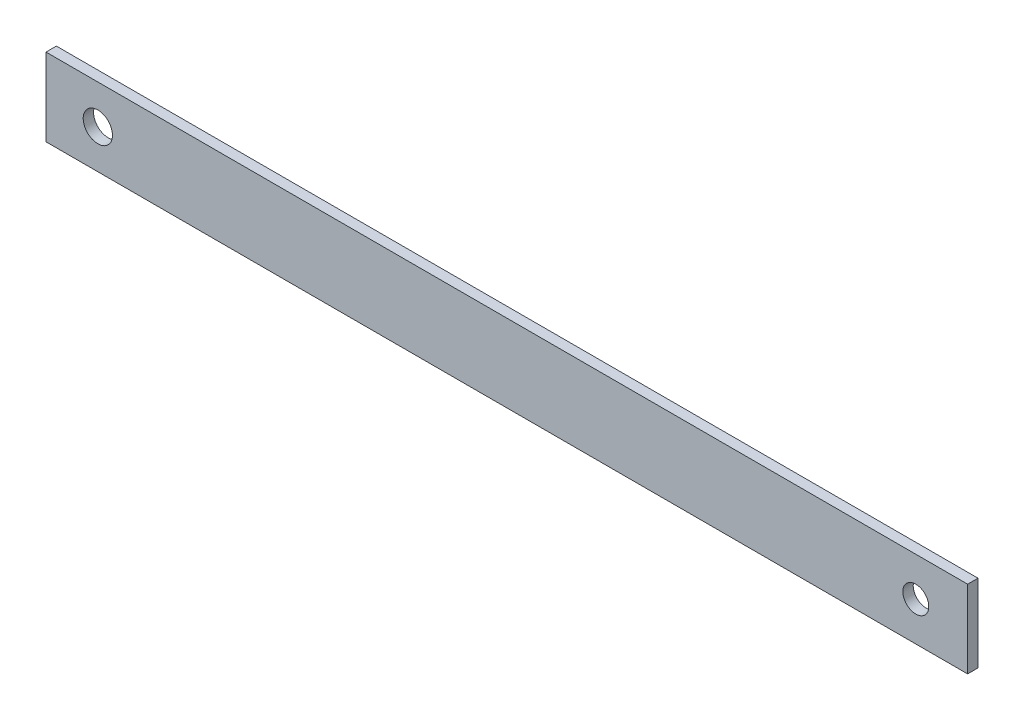
ISO-10303-21;
HEADER;
FILE_DESCRIPTION(('STEP AP214'),'2;1');
FILE_NAME('part.step','',(''),(''),'','','');
FILE_SCHEMA(('AUTOMOTIVE_DESIGN { 1 0 10303 214 1 1 1 1 }'));
ENDSEC;
DATA;
#1=APPLICATION_CONTEXT('core data for automotive mechanical design processes');
#2=APPLICATION_PROTOCOL_DEFINITION('international standard','automotive_design',2000,#1);
#3=PRODUCT_CONTEXT('',#1,'mechanical');
#4=PRODUCT('Part','Part','',(#3));
#5=PRODUCT_RELATED_PRODUCT_CATEGORY('part','',(#4));
#6=PRODUCT_DEFINITION_FORMATION('','',#4);
#7=PRODUCT_DEFINITION_CONTEXT('part definition',#1,'design');
#8=PRODUCT_DEFINITION('design','',#6,#7);
#9=PRODUCT_DEFINITION_SHAPE('','',#8);
#10=(LENGTH_UNIT() NAMED_UNIT(*) SI_UNIT(.MILLI.,.METRE.));
#11=(NAMED_UNIT(*) PLANE_ANGLE_UNIT() SI_UNIT($,.RADIAN.));
#12=(NAMED_UNIT(*) SI_UNIT($,.STERADIAN.) SOLID_ANGLE_UNIT());
#13=UNCERTAINTY_MEASURE_WITH_UNIT(LENGTH_MEASURE(1.E-05),#10,'distance_accuracy_value','');
#14=(GEOMETRIC_REPRESENTATION_CONTEXT(3) GLOBAL_UNCERTAINTY_ASSIGNED_CONTEXT((#13)) GLOBAL_UNIT_ASSIGNED_CONTEXT((#10,
#11,#12)) REPRESENTATION_CONTEXT('',''));
#15=CARTESIAN_POINT('',(0.,0.,0.));
#16=DIRECTION('',(0.,0.,1.));
#17=DIRECTION('',(1.,0.,0.));
#18=AXIS2_PLACEMENT_3D('',#15,#16,#17);
#19=CARTESIAN_POINT('',(0.,0.,-2.));
#20=DIRECTION('',(-1.,0.,0.));
#21=DIRECTION('',(0.,0.,1.));
#22=AXIS2_PLACEMENT_3D('',#19,#20,#21);
#23=PLANE('',#22);
#24=DIRECTION('',(0.,-1.,0.));
#25=VECTOR('',#24,1.);
#26=CARTESIAN_POINT('',(0.,0.,0.));
#27=LINE('',#26,#25);
#28=CARTESIAN_POINT('',(0.,15.,0.));
#29=VERTEX_POINT('',#28);
#30=CARTESIAN_POINT('',(0.,0.,0.));
#31=VERTEX_POINT('',#30);
#32=EDGE_CURVE('E104',#29,#31,#27,.T.);
#33=ORIENTED_EDGE('',*,*,#32,.F.);
#34=DIRECTION('',(0.,0.,1.));
#35=VECTOR('',#34,1.);
#36=CARTESIAN_POINT('',(0.,15.,-2.));
#37=LINE('',#36,#35);
#38=CARTESIAN_POINT('',(0.,15.,-2.));
#39=VERTEX_POINT('',#38);
#40=EDGE_CURVE('E11',#39,#29,#37,.T.);
#41=ORIENTED_EDGE('',*,*,#40,.F.);
#42=DIRECTION('',(0.,-1.,0.));
#43=VECTOR('',#42,1.);
#44=CARTESIAN_POINT('',(0.,0.,-2.));
#45=LINE('',#44,#43);
#46=CARTESIAN_POINT('',(0.,0.,-2.));
#47=VERTEX_POINT('',#46);
#48=EDGE_CURVE('E97',#39,#47,#45,.T.);
#49=ORIENTED_EDGE('',*,*,#48,.T.);
#50=DIRECTION('',(0.,0.,1.));
#51=VECTOR('',#50,1.);
#52=CARTESIAN_POINT('',(0.,0.,-2.));
#53=LINE('',#52,#51);
#54=EDGE_CURVE('E42',#47,#31,#53,.T.);
#55=ORIENTED_EDGE('',*,*,#54,.T.);
#56=EDGE_LOOP('',(#33,#41,#49,#55));
#57=FACE_BOUND('',#56,.T.);
#58=ADVANCED_FACE('F39',(#57),#23,.T.);
#59=CARTESIAN_POINT('',(0.,15.,-2.));
#60=DIRECTION('',(0.,1.,0.));
#61=DIRECTION('',(0.,0.,1.));
#62=AXIS2_PLACEMENT_3D('',#59,#60,#61);
#63=PLANE('',#62);
#64=DIRECTION('',(-1.,0.,0.));
#65=VECTOR('',#64,1.);
#66=CARTESIAN_POINT('',(0.,15.,0.));
#67=LINE('',#66,#65);
#68=CARTESIAN_POINT('',(177.8,15.,0.));
#69=VERTEX_POINT('',#68);
#70=EDGE_CURVE('E99',#69,#29,#67,.T.);
#71=ORIENTED_EDGE('',*,*,#70,.F.);
#72=DIRECTION('',(0.,0.,1.));
#73=VECTOR('',#72,1.);
#74=CARTESIAN_POINT('',(177.8,15.,-2.));
#75=LINE('',#74,#73);
#76=CARTESIAN_POINT('',(177.8,15.,-2.));
#77=VERTEX_POINT('',#76);
#78=EDGE_CURVE('E48',#77,#69,#75,.T.);
#79=ORIENTED_EDGE('',*,*,#78,.F.);
#80=DIRECTION('',(-1.,0.,0.));
#81=VECTOR('',#80,1.);
#82=CARTESIAN_POINT('',(0.,15.,-2.));
#83=LINE('',#82,#81);
#84=EDGE_CURVE('E94',#77,#39,#83,.T.);
#85=ORIENTED_EDGE('',*,*,#84,.T.);
#86=ORIENTED_EDGE('',*,*,#40,.T.);
#87=EDGE_LOOP('',(#71,#79,#85,#86));
#88=FACE_BOUND('',#87,.T.);
#89=ADVANCED_FACE('F115',(#88),#63,.T.);
#90=CARTESIAN_POINT('',(177.8,0.,-2.));
#91=DIRECTION('',(1.,0.,0.));
#92=DIRECTION('',(0.,0.,-1.));
#93=AXIS2_PLACEMENT_3D('',#90,#91,#92);
#94=PLANE('',#93);
#95=DIRECTION('',(0.,1.,0.));
#96=VECTOR('',#95,1.);
#97=CARTESIAN_POINT('',(177.8,0.,0.));
#98=LINE('',#97,#96);
#99=CARTESIAN_POINT('',(177.8,0.,0.));
#100=VERTEX_POINT('',#99);
#101=EDGE_CURVE('E89',#100,#69,#98,.T.);
#102=ORIENTED_EDGE('',*,*,#101,.F.);
#103=DIRECTION('',(0.,0.,1.));
#104=VECTOR('',#103,1.);
#105=CARTESIAN_POINT('',(177.8,0.,-2.));
#106=LINE('',#105,#104);
#107=CARTESIAN_POINT('',(177.8,0.,-2.));
#108=VERTEX_POINT('',#107);
#109=EDGE_CURVE('E84',#108,#100,#106,.T.);
#110=ORIENTED_EDGE('',*,*,#109,.F.);
#111=DIRECTION('',(0.,1.,0.));
#112=VECTOR('',#111,1.);
#113=CARTESIAN_POINT('',(177.8,0.,-2.));
#114=LINE('',#113,#112);
#115=EDGE_CURVE('E87',#108,#77,#114,.T.);
#116=ORIENTED_EDGE('',*,*,#115,.T.);
#117=ORIENTED_EDGE('',*,*,#78,.T.);
#118=EDGE_LOOP('',(#102,#110,#116,#117));
#119=FACE_BOUND('',#118,.T.);
#120=ADVANCED_FACE('F86',(#119),#94,.T.);
#121=CARTESIAN_POINT('',(0.,0.,-2.));
#122=DIRECTION('',(0.,-1.,0.));
#123=DIRECTION('',(0.,0.,-1.));
#124=AXIS2_PLACEMENT_3D('',#121,#122,#123);
#125=PLANE('',#124);
#126=DIRECTION('',(1.,0.,0.));
#127=VECTOR('',#126,1.);
#128=CARTESIAN_POINT('',(0.,0.,0.));
#129=LINE('',#128,#127);
#130=EDGE_CURVE('E107',#31,#100,#129,.T.);
#131=ORIENTED_EDGE('',*,*,#130,.F.);
#132=ORIENTED_EDGE('',*,*,#54,.F.);
#133=DIRECTION('',(1.,0.,0.));
#134=VECTOR('',#133,1.);
#135=CARTESIAN_POINT('',(0.,0.,-2.));
#136=LINE('',#135,#134);
#137=EDGE_CURVE('E93',#47,#108,#136,.T.);
#138=ORIENTED_EDGE('',*,*,#137,.T.);
#139=ORIENTED_EDGE('',*,*,#109,.T.);
#140=EDGE_LOOP('',(#131,#132,#138,#139));
#141=FACE_BOUND('',#140,.T.);
#142=ADVANCED_FACE('F96',(#141),#125,.T.);
#143=CARTESIAN_POINT('',(0.,0.,-2.));
#144=DIRECTION('',(0.,0.,-1.));
#145=DIRECTION('',(-1.,0.,0.));
#146=AXIS2_PLACEMENT_3D('',#143,#144,#145);
#147=PLANE('',#146);
#148=CARTESIAN_POINT('',(167.8,7.5,-2.));
#149=DIRECTION('',(0.,0.,-1.));
#150=DIRECTION('',(-1.,0.,0.));
#151=AXIS2_PLACEMENT_3D('',#148,#149,#150);
#152=CIRCLE('',#151,2.5);
#153=CARTESIAN_POINT('',(165.3,7.5,-2.));
#154=VERTEX_POINT('',#153);
#155=EDGE_CURVE('E148',#154,#154,#152,.F.);
#156=ORIENTED_EDGE('',*,*,#155,.T.);
#157=EDGE_LOOP('',(#156));
#158=FACE_BOUND('',#157,.T.);
#159=CARTESIAN_POINT('',(10.,7.5,-2.));
#160=DIRECTION('',(0.,0.,-1.));
#161=DIRECTION('',(-1.,0.,0.));
#162=AXIS2_PLACEMENT_3D('',#159,#160,#161);
#163=CIRCLE('',#162,2.82367117322598);
#164=CARTESIAN_POINT('',(7.17632882677402,7.5,-2.));
#165=VERTEX_POINT('',#164);
#166=EDGE_CURVE('E152',#165,#165,#163,.F.);
#167=ORIENTED_EDGE('',*,*,#166,.T.);
#168=EDGE_LOOP('',(#167));
#169=FACE_BOUND('',#168,.T.);
#170=ORIENTED_EDGE('',*,*,#48,.F.);
#171=ORIENTED_EDGE('',*,*,#84,.F.);
#172=ORIENTED_EDGE('',*,*,#115,.F.);
#173=ORIENTED_EDGE('',*,*,#137,.F.);
#174=EDGE_LOOP('',(#170,#171,#172,#173));
#175=FACE_BOUND('',#174,.T.);
#176=ADVANCED_FACE('F92',(#158,#169,#175),#147,.T.);
#177=CARTESIAN_POINT('',(0.,0.,0.));
#178=DIRECTION('',(0.,0.,-1.));
#179=DIRECTION('',(-1.,0.,0.));
#180=AXIS2_PLACEMENT_3D('',#177,#178,#179);
#181=PLANE('',#180);
#182=CARTESIAN_POINT('',(167.8,7.5,0.));
#183=DIRECTION('',(0.,0.,1.));
#184=DIRECTION('',(1.,0.,0.));
#185=AXIS2_PLACEMENT_3D('',#182,#183,#184);
#186=CIRCLE('',#185,2.5);
#187=CARTESIAN_POINT('',(170.3,7.5,0.));
#188=VERTEX_POINT('',#187);
#189=EDGE_CURVE('E151',#188,#188,#186,.T.);
#190=ORIENTED_EDGE('',*,*,#189,.F.);
#191=EDGE_LOOP('',(#190));
#192=FACE_BOUND('',#191,.T.);
#193=CARTESIAN_POINT('',(10.,7.5,0.));
#194=DIRECTION('',(0.,0.,1.));
#195=DIRECTION('',(1.,0.,0.));
#196=AXIS2_PLACEMENT_3D('',#193,#194,#195);
#197=CIRCLE('',#196,2.82367117322598);
#198=CARTESIAN_POINT('',(12.823671173226,7.5,0.));
#199=VERTEX_POINT('',#198);
#200=EDGE_CURVE('E108',#199,#199,#197,.T.);
#201=ORIENTED_EDGE('',*,*,#200,.F.);
#202=EDGE_LOOP('',(#201));
#203=FACE_BOUND('',#202,.T.);
#204=ORIENTED_EDGE('',*,*,#32,.T.);
#205=ORIENTED_EDGE('',*,*,#130,.T.);
#206=ORIENTED_EDGE('',*,*,#101,.T.);
#207=ORIENTED_EDGE('',*,*,#70,.T.);
#208=EDGE_LOOP('',(#204,#205,#206,#207));
#209=FACE_BOUND('',#208,.T.);
#210=ADVANCED_FACE('F114',(#192,#203,#209),#181,.F.);
#211=CARTESIAN_POINT('',(10.,7.5,-2.001));
#212=DIRECTION('',(0.,0.,1.));
#213=DIRECTION('',(1.,0.,0.));
#214=AXIS2_PLACEMENT_3D('',#211,#212,#213);
#215=CYLINDRICAL_SURFACE('',#214,2.82367117322598);
#216=ORIENTED_EDGE('',*,*,#166,.F.);
#217=EDGE_LOOP('',(#216));
#218=FACE_BOUND('',#217,.T.);
#219=ORIENTED_EDGE('',*,*,#200,.T.);
#220=EDGE_LOOP('',(#219));
#221=FACE_BOUND('',#220,.T.);
#222=ADVANCED_FACE('F133',(#218,#221),#215,.F.);
#223=CARTESIAN_POINT('',(167.8,7.5,-2.001));
#224=DIRECTION('',(0.,0.,1.));
#225=DIRECTION('',(1.,0.,0.));
#226=AXIS2_PLACEMENT_3D('',#223,#224,#225);
#227=CYLINDRICAL_SURFACE('',#226,2.5);
#228=ORIENTED_EDGE('',*,*,#155,.F.);
#229=EDGE_LOOP('',(#228));
#230=FACE_BOUND('',#229,.T.);
#231=ORIENTED_EDGE('',*,*,#189,.T.);
#232=EDGE_LOOP('',(#231));
#233=FACE_BOUND('',#232,.T.);
#234=ADVANCED_FACE('F140',(#230,#233),#227,.F.);
#235=CLOSED_SHELL('',(#58,#89,#120,#142,#176,#210,#222,#234));
#236=MANIFOLD_SOLID_BREP('B2',#235);
#237=ADVANCED_BREP_SHAPE_REPRESENTATION('',(#18,#236),#14);
#238=SHAPE_DEFINITION_REPRESENTATION(#9,#237);
ENDSEC;
END-ISO-10303-21;
